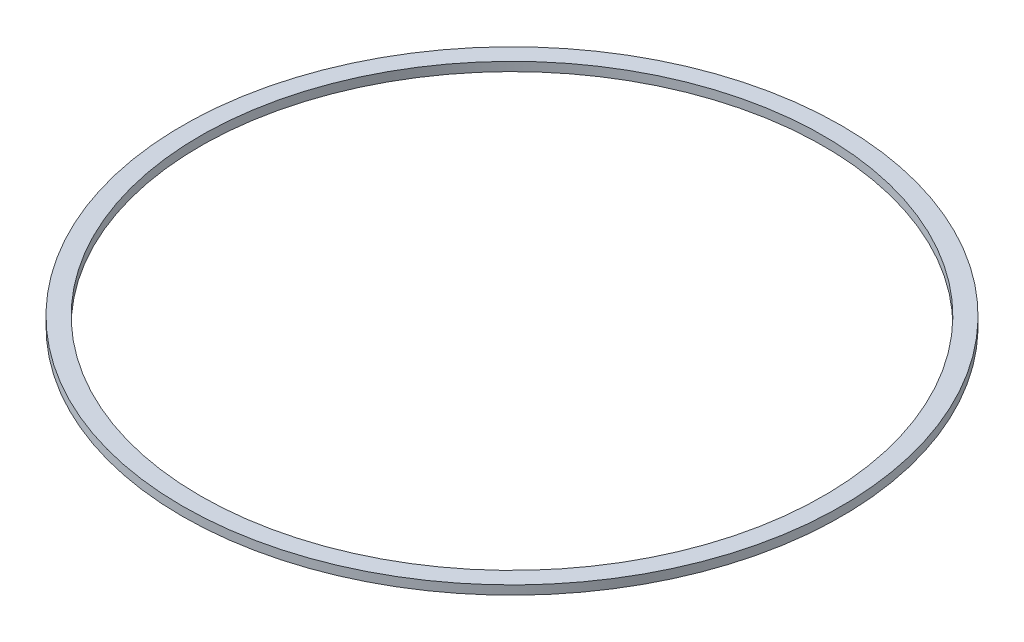
ISO-10303-21;
HEADER;
FILE_DESCRIPTION(('STEP AP214'),'2;1');
FILE_NAME('part.step','',(''),(''),'','','');
FILE_SCHEMA(('AUTOMOTIVE_DESIGN { 1 0 10303 214 1 1 1 1 }'));
ENDSEC;
DATA;
#1=APPLICATION_CONTEXT('core data for automotive mechanical design processes');
#2=APPLICATION_PROTOCOL_DEFINITION('international standard','automotive_design',2000,#1);
#3=PRODUCT_CONTEXT('',#1,'mechanical');
#4=PRODUCT('Part','Part','',(#3));
#5=PRODUCT_RELATED_PRODUCT_CATEGORY('part','',(#4));
#6=PRODUCT_DEFINITION_FORMATION('','',#4);
#7=PRODUCT_DEFINITION_CONTEXT('part definition',#1,'design');
#8=PRODUCT_DEFINITION('design','',#6,#7);
#9=PRODUCT_DEFINITION_SHAPE('','',#8);
#10=(LENGTH_UNIT() NAMED_UNIT(*) SI_UNIT(.MILLI.,.METRE.));
#11=(NAMED_UNIT(*) PLANE_ANGLE_UNIT() SI_UNIT($,.RADIAN.));
#12=(NAMED_UNIT(*) SI_UNIT($,.STERADIAN.) SOLID_ANGLE_UNIT());
#13=UNCERTAINTY_MEASURE_WITH_UNIT(LENGTH_MEASURE(1.E-05),#10,'distance_accuracy_value','');
#14=(GEOMETRIC_REPRESENTATION_CONTEXT(3) GLOBAL_UNCERTAINTY_ASSIGNED_CONTEXT((#13)) GLOBAL_UNIT_ASSIGNED_CONTEXT((#10,
#11,#12)) REPRESENTATION_CONTEXT('',''));
#15=CARTESIAN_POINT('',(0.,0.,0.));
#16=DIRECTION('',(0.,0.,1.));
#17=DIRECTION('',(1.,0.,0.));
#18=AXIS2_PLACEMENT_3D('',#15,#16,#17);
#19=CARTESIAN_POINT('',(0.,1.,0.));
#20=DIRECTION('',(0.,1.,0.));
#21=DIRECTION('',(0.,0.,1.));
#22=AXIS2_PLACEMENT_3D('',#19,#20,#21);
#23=PLANE('',#22);
#24=CARTESIAN_POINT('',(0.,1.,0.));
#25=DIRECTION('',(0.,1.,0.));
#26=DIRECTION('',(0.,0.,1.));
#27=AXIS2_PLACEMENT_3D('',#24,#25,#26);
#28=CIRCLE('',#27,37.);
#29=CARTESIAN_POINT('',(0.,1.,37.));
#30=VERTEX_POINT('',#29);
#31=EDGE_CURVE('E10',#30,#30,#28,.T.);
#32=ORIENTED_EDGE('',*,*,#31,.T.);
#33=EDGE_LOOP('',(#32));
#34=FACE_BOUND('',#33,.T.);
#35=CARTESIAN_POINT('',(0.,1.,0.));
#36=DIRECTION('',(0.,1.,0.));
#37=DIRECTION('',(0.,0.,1.));
#38=AXIS2_PLACEMENT_3D('',#35,#36,#37);
#39=CIRCLE('',#38,35.);
#40=CARTESIAN_POINT('',(0.,1.,35.));
#41=VERTEX_POINT('',#40);
#42=EDGE_CURVE('E41',#41,#41,#39,.T.);
#43=ORIENTED_EDGE('',*,*,#42,.F.);
#44=EDGE_LOOP('',(#43));
#45=FACE_BOUND('',#44,.T.);
#46=ADVANCED_FACE('F30',(#34,#45),#23,.T.);
#47=CARTESIAN_POINT('',(0.,0.,0.));
#48=DIRECTION('',(0.,1.,0.));
#49=DIRECTION('',(0.,0.,1.));
#50=AXIS2_PLACEMENT_3D('',#47,#48,#49);
#51=PLANE('',#50);
#52=CARTESIAN_POINT('',(0.,0.,0.));
#53=DIRECTION('',(0.,1.,0.));
#54=DIRECTION('',(0.,0.,1.));
#55=AXIS2_PLACEMENT_3D('',#52,#53,#54);
#56=CIRCLE('',#55,37.);
#57=CARTESIAN_POINT('',(0.,0.,37.));
#58=VERTEX_POINT('',#57);
#59=EDGE_CURVE('E34',#58,#58,#56,.T.);
#60=ORIENTED_EDGE('',*,*,#59,.F.);
#61=EDGE_LOOP('',(#60));
#62=FACE_BOUND('',#61,.T.);
#63=CARTESIAN_POINT('',(0.,0.,0.));
#64=DIRECTION('',(0.,1.,0.));
#65=DIRECTION('',(0.,0.,1.));
#66=AXIS2_PLACEMENT_3D('',#63,#64,#65);
#67=CIRCLE('',#66,35.);
#68=CARTESIAN_POINT('',(0.,0.,35.));
#69=VERTEX_POINT('',#68);
#70=EDGE_CURVE('E43',#69,#69,#67,.T.);
#71=ORIENTED_EDGE('',*,*,#70,.T.);
#72=EDGE_LOOP('',(#71));
#73=FACE_BOUND('',#72,.T.);
#74=ADVANCED_FACE('F53',(#62,#73),#51,.F.);
#75=CARTESIAN_POINT('',(0.,1.,0.));
#76=DIRECTION('',(0.,-1.,0.));
#77=DIRECTION('',(0.,0.,-1.));
#78=AXIS2_PLACEMENT_3D('',#75,#76,#77);
#79=CYLINDRICAL_SURFACE('',#78,37.);
#80=ORIENTED_EDGE('',*,*,#31,.F.);
#81=EDGE_LOOP('',(#80));
#82=FACE_BOUND('',#81,.T.);
#83=ORIENTED_EDGE('',*,*,#59,.T.);
#84=EDGE_LOOP('',(#83));
#85=FACE_BOUND('',#84,.T.);
#86=ADVANCED_FACE('F32',(#82,#85),#79,.T.);
#87=CARTESIAN_POINT('',(0.,1.,0.));
#88=DIRECTION('',(0.,-1.,0.));
#89=DIRECTION('',(0.,0.,-1.));
#90=AXIS2_PLACEMENT_3D('',#87,#88,#89);
#91=CYLINDRICAL_SURFACE('',#90,35.);
#92=ORIENTED_EDGE('',*,*,#42,.T.);
#93=EDGE_LOOP('',(#92));
#94=FACE_BOUND('',#93,.T.);
#95=ORIENTED_EDGE('',*,*,#70,.F.);
#96=EDGE_LOOP('',(#95));
#97=FACE_BOUND('',#96,.T.);
#98=ADVANCED_FACE('F49',(#94,#97),#91,.F.);
#99=CLOSED_SHELL('',(#46,#74,#86,#98));
#100=MANIFOLD_SOLID_BREP('B2',#99);
#101=ADVANCED_BREP_SHAPE_REPRESENTATION('',(#18,#100),#14);
#102=SHAPE_DEFINITION_REPRESENTATION(#9,#101);
ENDSEC;
END-ISO-10303-21;
